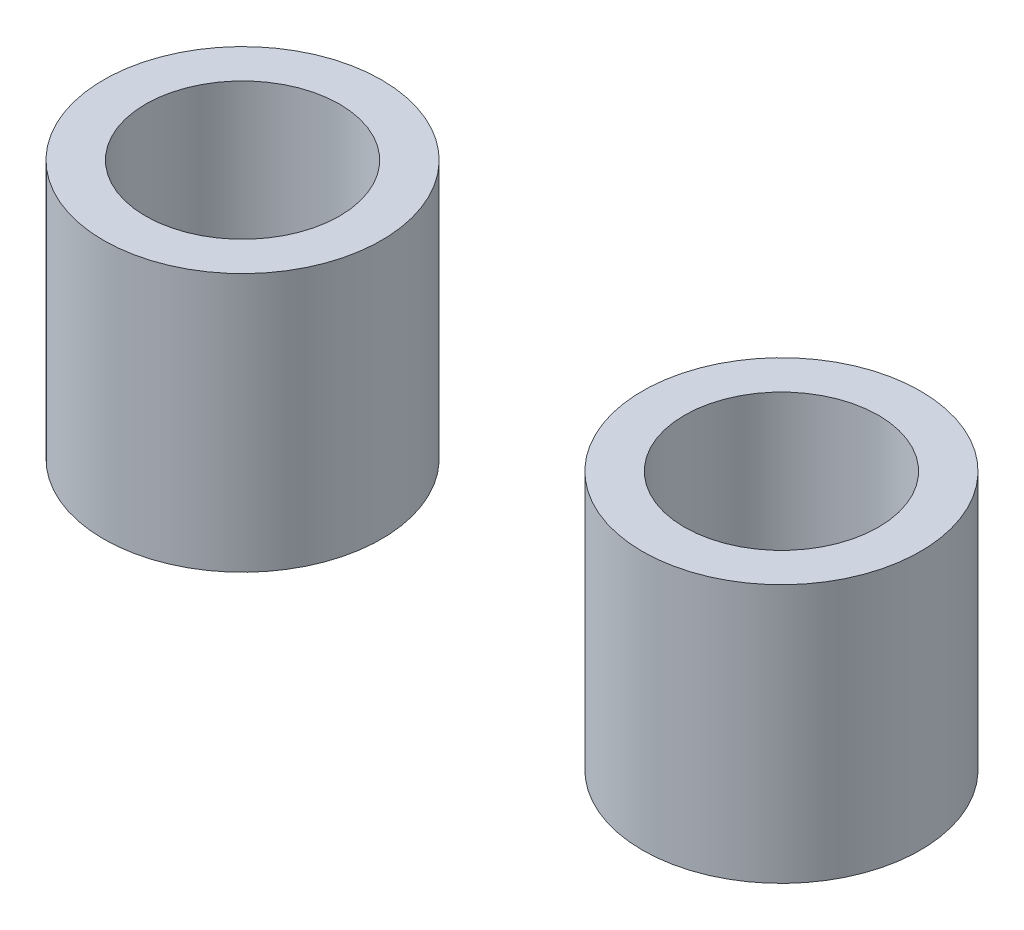
ISO-10303-21;
HEADER;
FILE_DESCRIPTION(('STEP AP214'),'2;1');
FILE_NAME('part.step','',(''),(''),'','','');
FILE_SCHEMA(('AUTOMOTIVE_DESIGN { 1 0 10303 214 1 1 1 1 }'));
ENDSEC;
DATA;
#1=APPLICATION_CONTEXT('core data for automotive mechanical design processes');
#2=APPLICATION_PROTOCOL_DEFINITION('international standard','automotive_design',2000,#1);
#3=PRODUCT_CONTEXT('',#1,'mechanical');
#4=PRODUCT('Part','Part','',(#3));
#5=PRODUCT_RELATED_PRODUCT_CATEGORY('part','',(#4));
#6=PRODUCT_DEFINITION_FORMATION('','',#4);
#7=PRODUCT_DEFINITION_CONTEXT('part definition',#1,'design');
#8=PRODUCT_DEFINITION('design','',#6,#7);
#9=PRODUCT_DEFINITION_SHAPE('','',#8);
#10=(LENGTH_UNIT() NAMED_UNIT(*) SI_UNIT(.MILLI.,.METRE.));
#11=(NAMED_UNIT(*) PLANE_ANGLE_UNIT() SI_UNIT($,.RADIAN.));
#12=(NAMED_UNIT(*) SI_UNIT($,.STERADIAN.) SOLID_ANGLE_UNIT());
#13=UNCERTAINTY_MEASURE_WITH_UNIT(LENGTH_MEASURE(1.E-05),#10,'distance_accuracy_value','');
#14=(GEOMETRIC_REPRESENTATION_CONTEXT(3) GLOBAL_UNCERTAINTY_ASSIGNED_CONTEXT((#13)) GLOBAL_UNIT_ASSIGNED_CONTEXT((#10,
#11,#12)) REPRESENTATION_CONTEXT('',''));
#15=CARTESIAN_POINT('',(0.,0.,0.));
#16=DIRECTION('',(0.,0.,1.));
#17=DIRECTION('',(1.,0.,0.));
#18=AXIS2_PLACEMENT_3D('',#15,#16,#17);
#19=CARTESIAN_POINT('',(0.,3.048,0.));
#20=DIRECTION('',(0.,1.,0.));
#21=DIRECTION('',(0.,0.,1.));
#22=AXIS2_PLACEMENT_3D('',#19,#20,#21);
#23=PLANE('',#22);
#24=CARTESIAN_POINT('',(0.,3.048,0.));
#25=DIRECTION('',(0.,1.,0.));
#26=DIRECTION('',(0.,0.,1.));
#27=AXIS2_PLACEMENT_3D('',#24,#25,#26);
#28=CIRCLE('',#27,1.6383);
#29=CARTESIAN_POINT('',(0.,3.048,-1.6383));
#30=VERTEX_POINT('',#29);
#31=EDGE_CURVE('E11',#30,#30,#28,.T.);
#32=ORIENTED_EDGE('',*,*,#31,.T.);
#33=EDGE_LOOP('',(#32));
#34=FACE_BOUND('',#33,.T.);
#35=CARTESIAN_POINT('',(0.,3.048,0.));
#36=DIRECTION('',(0.,1.,0.));
#37=DIRECTION('',(0.,0.,1.));
#38=AXIS2_PLACEMENT_3D('',#35,#36,#37);
#39=CIRCLE('',#38,1.143);
#40=CARTESIAN_POINT('',(0.,3.048,-1.143));
#41=VERTEX_POINT('',#40);
#42=EDGE_CURVE('E50',#41,#41,#39,.T.);
#43=ORIENTED_EDGE('',*,*,#42,.F.);
#44=EDGE_LOOP('',(#43));
#45=FACE_BOUND('',#44,.T.);
#46=ADVANCED_FACE('F39',(#34,#45),#23,.T.);
#47=CARTESIAN_POINT('',(0.,0.,0.));
#48=DIRECTION('',(0.,1.,0.));
#49=DIRECTION('',(0.,0.,1.));
#50=AXIS2_PLACEMENT_3D('',#47,#48,#49);
#51=PLANE('',#50);
#52=CARTESIAN_POINT('',(0.,0.,0.));
#53=DIRECTION('',(0.,1.,0.));
#54=DIRECTION('',(0.,0.,1.));
#55=AXIS2_PLACEMENT_3D('',#52,#53,#54);
#56=CIRCLE('',#55,1.6383);
#57=CARTESIAN_POINT('',(0.,0.,-1.6383));
#58=VERTEX_POINT('',#57);
#59=EDGE_CURVE('E43',#58,#58,#56,.T.);
#60=ORIENTED_EDGE('',*,*,#59,.F.);
#61=EDGE_LOOP('',(#60));
#62=FACE_BOUND('',#61,.T.);
#63=CARTESIAN_POINT('',(0.,0.,0.));
#64=DIRECTION('',(0.,1.,0.));
#65=DIRECTION('',(0.,0.,1.));
#66=AXIS2_PLACEMENT_3D('',#63,#64,#65);
#67=CIRCLE('',#66,1.143);
#68=CARTESIAN_POINT('',(0.,0.,-1.143));
#69=VERTEX_POINT('',#68);
#70=EDGE_CURVE('E52',#69,#69,#67,.T.);
#71=ORIENTED_EDGE('',*,*,#70,.T.);
#72=EDGE_LOOP('',(#71));
#73=FACE_BOUND('',#72,.T.);
#74=ADVANCED_FACE('F62',(#62,#73),#51,.F.);
#75=CARTESIAN_POINT('',(0.,3.048,0.));
#76=DIRECTION('',(0.,-1.,0.));
#77=DIRECTION('',(0.,0.,-1.));
#78=AXIS2_PLACEMENT_3D('',#75,#76,#77);
#79=CYLINDRICAL_SURFACE('',#78,1.6383);
#80=CARTESIAN_POINT('',(0.,3.048,-1.6383));
#81=CARTESIAN_POINT('',(0.,3.01625,-1.6383));
#82=CARTESIAN_POINT('',(0.,2.9845,-1.6383));
#83=CARTESIAN_POINT('',(0.,2.921,-1.6383));
#84=CARTESIAN_POINT('',(0.,2.88925,-1.6383));
#85=CARTESIAN_POINT('',(0.,2.82575,-1.6383));
#86=CARTESIAN_POINT('',(0.,2.794,-1.6383));
#87=CARTESIAN_POINT('',(0.,2.7305,-1.6383));
#88=CARTESIAN_POINT('',(0.,2.69875,-1.6383));
#89=CARTESIAN_POINT('',(0.,2.63525,-1.6383));
#90=CARTESIAN_POINT('',(0.,2.6035,-1.6383));
#91=CARTESIAN_POINT('',(0.,2.54,-1.6383));
#92=CARTESIAN_POINT('',(0.,2.50825,-1.6383));
#93=CARTESIAN_POINT('',(0.,2.44475,-1.6383));
#94=CARTESIAN_POINT('',(0.,2.413,-1.6383));
#95=CARTESIAN_POINT('',(0.,2.3495,-1.6383));
#96=CARTESIAN_POINT('',(0.,2.31775,-1.6383));
#97=CARTESIAN_POINT('',(0.,2.25425,-1.6383));
#98=CARTESIAN_POINT('',(0.,2.2225,-1.6383));
#99=CARTESIAN_POINT('',(0.,2.159,-1.6383));
#100=CARTESIAN_POINT('',(0.,2.12725,-1.6383));
#101=CARTESIAN_POINT('',(0.,2.06375,-1.6383));
#102=CARTESIAN_POINT('',(0.,2.032,-1.6383));
#103=CARTESIAN_POINT('',(0.,1.9685,-1.6383));
#104=CARTESIAN_POINT('',(0.,1.93675,-1.6383));
#105=CARTESIAN_POINT('',(0.,1.87325,-1.6383));
#106=CARTESIAN_POINT('',(0.,1.8415,-1.6383));
#107=CARTESIAN_POINT('',(0.,1.778,-1.6383));
#108=CARTESIAN_POINT('',(0.,1.74625,-1.6383));
#109=CARTESIAN_POINT('',(0.,1.68275,-1.6383));
#110=CARTESIAN_POINT('',(0.,1.651,-1.6383));
#111=CARTESIAN_POINT('',(0.,1.5875,-1.6383));
#112=CARTESIAN_POINT('',(0.,1.55575,-1.6383));
#113=CARTESIAN_POINT('',(0.,1.49225,-1.6383));
#114=CARTESIAN_POINT('',(0.,1.4605,-1.6383));
#115=CARTESIAN_POINT('',(0.,1.397,-1.6383));
#116=CARTESIAN_POINT('',(0.,1.36525,-1.6383));
#117=CARTESIAN_POINT('',(0.,1.30175,-1.6383));
#118=CARTESIAN_POINT('',(0.,1.27,-1.6383));
#119=CARTESIAN_POINT('',(0.,1.2065,-1.6383));
#120=CARTESIAN_POINT('',(0.,1.17475,-1.6383));
#121=CARTESIAN_POINT('',(0.,1.11125,-1.6383));
#122=CARTESIAN_POINT('',(0.,1.0795,-1.6383));
#123=CARTESIAN_POINT('',(0.,1.016,-1.6383));
#124=CARTESIAN_POINT('',(0.,0.98425,-1.6383));
#125=CARTESIAN_POINT('',(0.,0.92075,-1.6383));
#126=CARTESIAN_POINT('',(0.,0.889,-1.6383));
#127=CARTESIAN_POINT('',(0.,0.8255,-1.6383));
#128=CARTESIAN_POINT('',(0.,0.79375,-1.6383));
#129=CARTESIAN_POINT('',(0.,0.73025,-1.6383));
#130=CARTESIAN_POINT('',(0.,0.6985,-1.6383));
#131=CARTESIAN_POINT('',(0.,0.635,-1.6383));
#132=CARTESIAN_POINT('',(0.,0.60325,-1.6383));
#133=CARTESIAN_POINT('',(0.,0.53975,-1.6383));
#134=CARTESIAN_POINT('',(0.,0.508,-1.6383));
#135=CARTESIAN_POINT('',(0.,0.4445,-1.6383));
#136=CARTESIAN_POINT('',(0.,0.41275,-1.6383));
#137=CARTESIAN_POINT('',(0.,0.34925,-1.6383));
#138=CARTESIAN_POINT('',(0.,0.3175,-1.6383));
#139=CARTESIAN_POINT('',(0.,0.254,-1.6383));
#140=CARTESIAN_POINT('',(0.,0.22225,-1.6383));
#141=CARTESIAN_POINT('',(0.,0.15875,-1.6383));
#142=CARTESIAN_POINT('',(0.,0.127,-1.6383));
#143=CARTESIAN_POINT('',(0.,0.0634999999999999,-1.6383));
#144=CARTESIAN_POINT('',(0.,0.03175,-1.6383));
#145=CARTESIAN_POINT('',(0.,0.,-1.6383));
#146=B_SPLINE_CURVE_WITH_KNOTS('',3,(#80,#81,#82,#83,#84,#85,#86,#87,#88,#89,#90,#91,#92,#93,
#94,#95,#96,#97,#98,#99,#100,#101,#102,#103,#104,#105,#106,#107,#108,#109,#110,#111,#112,#113,
#114,#115,#116,#117,#118,#119,#120,#121,#122,#123,#124,#125,#126,#127,#128,#129,#130,#131,#132,
#133,#134,#135,#136,#137,#138,#139,#140,#141,#142,#143,#144,#145),.UNSPECIFIED.,.F.,.F.,(4,2,2,
2,2,2,2,2,2,2,2,2,2,2,2,2,2,2,2,2,2,2,2,2,2,2,2,2,2,2,2,2,4),(0.,0.0952500000000003,0.1905,
0.28575,0.381,0.47625,0.5715,0.66675,0.762,0.85725,0.9525,1.04775,1.143,1.23825,1.3335,1.42875,
1.524,1.61925,1.7145,1.80975,1.905,2.00025,2.0955,2.19075,2.286,2.38125,2.4765,2.57175,2.667,
2.76225,2.8575,2.95275,3.048),.UNSPECIFIED.);
#147=EDGE_CURVE('BSEAM41',#30,#58,#146,.T.);
#148=ORIENTED_EDGE('',*,*,#31,.F.);
#149=ORIENTED_EDGE('',*,*,#59,.T.);
#150=ORIENTED_EDGE('',*,*,#147,.T.);
#151=ORIENTED_EDGE('',*,*,#147,.F.);
#152=EDGE_LOOP('',(#148,#150,#149,#151));
#153=FACE_BOUND('',#152,.T.);
#154=ADVANCED_FACE('F41',(#153),#79,.T.);
#155=CARTESIAN_POINT('',(0.,3.048,0.));
#156=DIRECTION('',(0.,-1.,0.));
#157=DIRECTION('',(0.,0.,-1.));
#158=AXIS2_PLACEMENT_3D('',#155,#156,#157);
#159=CYLINDRICAL_SURFACE('',#158,1.143);
#160=CARTESIAN_POINT('',(0.,3.048,-1.143));
#161=CARTESIAN_POINT('',(0.,3.01625,-1.143));
#162=CARTESIAN_POINT('',(0.,2.9845,-1.143));
#163=CARTESIAN_POINT('',(0.,2.921,-1.143));
#164=CARTESIAN_POINT('',(0.,2.88925,-1.143));
#165=CARTESIAN_POINT('',(0.,2.82575,-1.143));
#166=CARTESIAN_POINT('',(0.,2.794,-1.143));
#167=CARTESIAN_POINT('',(0.,2.7305,-1.143));
#168=CARTESIAN_POINT('',(0.,2.69875,-1.143));
#169=CARTESIAN_POINT('',(0.,2.63525,-1.143));
#170=CARTESIAN_POINT('',(0.,2.6035,-1.143));
#171=CARTESIAN_POINT('',(0.,2.54,-1.143));
#172=CARTESIAN_POINT('',(0.,2.50825,-1.143));
#173=CARTESIAN_POINT('',(0.,2.44475,-1.143));
#174=CARTESIAN_POINT('',(0.,2.413,-1.143));
#175=CARTESIAN_POINT('',(0.,2.3495,-1.143));
#176=CARTESIAN_POINT('',(0.,2.31775,-1.143));
#177=CARTESIAN_POINT('',(0.,2.25425,-1.143));
#178=CARTESIAN_POINT('',(0.,2.2225,-1.143));
#179=CARTESIAN_POINT('',(0.,2.159,-1.143));
#180=CARTESIAN_POINT('',(0.,2.12725,-1.143));
#181=CARTESIAN_POINT('',(0.,2.06375,-1.143));
#182=CARTESIAN_POINT('',(0.,2.032,-1.143));
#183=CARTESIAN_POINT('',(0.,1.9685,-1.143));
#184=CARTESIAN_POINT('',(0.,1.93675,-1.143));
#185=CARTESIAN_POINT('',(0.,1.87325,-1.143));
#186=CARTESIAN_POINT('',(0.,1.8415,-1.143));
#187=CARTESIAN_POINT('',(0.,1.778,-1.143));
#188=CARTESIAN_POINT('',(0.,1.74625,-1.143));
#189=CARTESIAN_POINT('',(0.,1.68275,-1.143));
#190=CARTESIAN_POINT('',(0.,1.651,-1.143));
#191=CARTESIAN_POINT('',(0.,1.5875,-1.143));
#192=CARTESIAN_POINT('',(0.,1.55575,-1.143));
#193=CARTESIAN_POINT('',(0.,1.49225,-1.143));
#194=CARTESIAN_POINT('',(0.,1.4605,-1.143));
#195=CARTESIAN_POINT('',(0.,1.397,-1.143));
#196=CARTESIAN_POINT('',(0.,1.36525,-1.143));
#197=CARTESIAN_POINT('',(0.,1.30175,-1.143));
#198=CARTESIAN_POINT('',(0.,1.27,-1.143));
#199=CARTESIAN_POINT('',(0.,1.2065,-1.143));
#200=CARTESIAN_POINT('',(0.,1.17475,-1.143));
#201=CARTESIAN_POINT('',(0.,1.11125,-1.143));
#202=CARTESIAN_POINT('',(0.,1.0795,-1.143));
#203=CARTESIAN_POINT('',(0.,1.016,-1.143));
#204=CARTESIAN_POINT('',(0.,0.98425,-1.143));
#205=CARTESIAN_POINT('',(0.,0.92075,-1.143));
#206=CARTESIAN_POINT('',(0.,0.889,-1.143));
#207=CARTESIAN_POINT('',(0.,0.8255,-1.143));
#208=CARTESIAN_POINT('',(0.,0.79375,-1.143));
#209=CARTESIAN_POINT('',(0.,0.73025,-1.143));
#210=CARTESIAN_POINT('',(0.,0.6985,-1.143));
#211=CARTESIAN_POINT('',(0.,0.635,-1.143));
#212=CARTESIAN_POINT('',(0.,0.60325,-1.143));
#213=CARTESIAN_POINT('',(0.,0.53975,-1.143));
#214=CARTESIAN_POINT('',(0.,0.508,-1.143));
#215=CARTESIAN_POINT('',(0.,0.4445,-1.143));
#216=CARTESIAN_POINT('',(0.,0.41275,-1.143));
#217=CARTESIAN_POINT('',(0.,0.34925,-1.143));
#218=CARTESIAN_POINT('',(0.,0.3175,-1.143));
#219=CARTESIAN_POINT('',(0.,0.254,-1.143));
#220=CARTESIAN_POINT('',(0.,0.22225,-1.143));
#221=CARTESIAN_POINT('',(0.,0.15875,-1.143));
#222=CARTESIAN_POINT('',(0.,0.127,-1.143));
#223=CARTESIAN_POINT('',(0.,0.0634999999999999,-1.143));
#224=CARTESIAN_POINT('',(0.,0.03175,-1.143));
#225=CARTESIAN_POINT('',(0.,0.,-1.143));
#226=B_SPLINE_CURVE_WITH_KNOTS('',3,(#160,#161,#162,#163,#164,#165,#166,#167,#168,#169,#170,
#171,#172,#173,#174,#175,#176,#177,#178,#179,#180,#181,#182,#183,#184,#185,#186,#187,#188,#189,
#190,#191,#192,#193,#194,#195,#196,#197,#198,#199,#200,#201,#202,#203,#204,#205,#206,#207,#208,
#209,#210,#211,#212,#213,#214,#215,#216,#217,#218,#219,#220,#221,#222,#223,#224,#225),
.UNSPECIFIED.,.F.,.F.,(4,2,2,2,2,2,2,2,2,2,2,2,2,2,2,2,2,2,2,2,2,2,2,2,2,2,2,2,2,2,2,2,4),(0.,
0.0952499999999998,0.1905,0.28575,0.381,0.47625,0.5715,0.66675,0.762,0.85725,0.9525,1.04775,
1.143,1.23825,1.3335,1.42875,1.524,1.61925,1.7145,1.80975,1.905,2.00025,2.0955,2.19075,2.286,
2.38125,2.4765,2.57175,2.667,2.76225,2.8575,2.95275,3.048),.UNSPECIFIED.);
#227=EDGE_CURVE('BSEAM58',#41,#69,#226,.T.);
#228=ORIENTED_EDGE('',*,*,#42,.T.);
#229=ORIENTED_EDGE('',*,*,#70,.F.);
#230=ORIENTED_EDGE('',*,*,#227,.T.);
#231=ORIENTED_EDGE('',*,*,#227,.F.);
#232=EDGE_LOOP('',(#228,#230,#229,#231));
#233=FACE_BOUND('',#232,.T.);
#234=ADVANCED_FACE('F58',(#233),#159,.F.);
#235=CLOSED_SHELL('',(#46,#74,#154,#234));
#236=MANIFOLD_SOLID_BREP('B2',#235);
#237=CARTESIAN_POINT('',(6.35,3.048,0.));
#238=DIRECTION('',(0.,1.,0.));
#239=DIRECTION('',(0.,0.,1.));
#240=AXIS2_PLACEMENT_3D('',#237,#238,#239);
#241=PLANE('',#240);
#242=CARTESIAN_POINT('',(6.35,3.048,0.));
#243=DIRECTION('',(0.,1.,0.));
#244=DIRECTION('',(0.,0.,1.));
#245=AXIS2_PLACEMENT_3D('',#242,#243,#244);
#246=CIRCLE('',#245,1.6383);
#247=CARTESIAN_POINT('',(6.35,3.048,-1.6383));
#248=VERTEX_POINT('',#247);
#249=EDGE_CURVE('E38',#248,#248,#246,.T.);
#250=ORIENTED_EDGE('',*,*,#249,.T.);
#251=EDGE_LOOP('',(#250));
#252=FACE_BOUND('',#251,.T.);
#253=CARTESIAN_POINT('',(6.35,3.048,0.));
#254=DIRECTION('',(0.,1.,0.));
#255=DIRECTION('',(0.,0.,1.));
#256=AXIS2_PLACEMENT_3D('',#253,#254,#255);
#257=CIRCLE('',#256,1.143);
#258=CARTESIAN_POINT('',(6.35,3.048,-1.143));
#259=VERTEX_POINT('',#258);
#260=EDGE_CURVE('E112',#259,#259,#257,.T.);
#261=ORIENTED_EDGE('',*,*,#260,.F.);
#262=EDGE_LOOP('',(#261));
#263=FACE_BOUND('',#262,.T.);
#264=ADVANCED_FACE('F101',(#252,#263),#241,.T.);
#265=CARTESIAN_POINT('',(6.35,0.,0.));
#266=DIRECTION('',(0.,1.,0.));
#267=DIRECTION('',(0.,0.,1.));
#268=AXIS2_PLACEMENT_3D('',#265,#266,#267);
#269=PLANE('',#268);
#270=CARTESIAN_POINT('',(6.35,0.,0.));
#271=DIRECTION('',(0.,1.,0.));
#272=DIRECTION('',(0.,0.,1.));
#273=AXIS2_PLACEMENT_3D('',#270,#271,#272);
#274=CIRCLE('',#273,1.6383);
#275=CARTESIAN_POINT('',(6.35,0.,-1.6383));
#276=VERTEX_POINT('',#275);
#277=EDGE_CURVE('E105',#276,#276,#274,.T.);
#278=ORIENTED_EDGE('',*,*,#277,.F.);
#279=EDGE_LOOP('',(#278));
#280=FACE_BOUND('',#279,.T.);
#281=CARTESIAN_POINT('',(6.35,0.,0.));
#282=DIRECTION('',(0.,1.,0.));
#283=DIRECTION('',(0.,0.,1.));
#284=AXIS2_PLACEMENT_3D('',#281,#282,#283);
#285=CIRCLE('',#284,1.143);
#286=CARTESIAN_POINT('',(6.35,0.,-1.143));
#287=VERTEX_POINT('',#286);
#288=EDGE_CURVE('E114',#287,#287,#285,.T.);
#289=ORIENTED_EDGE('',*,*,#288,.T.);
#290=EDGE_LOOP('',(#289));
#291=FACE_BOUND('',#290,.T.);
#292=ADVANCED_FACE('F124',(#280,#291),#269,.F.);
#293=CARTESIAN_POINT('',(6.35,3.048,0.));
#294=DIRECTION('',(0.,-1.,0.));
#295=DIRECTION('',(0.,0.,-1.));
#296=AXIS2_PLACEMENT_3D('',#293,#294,#295);
#297=CYLINDRICAL_SURFACE('',#296,1.6383);
#298=CARTESIAN_POINT('',(6.35,3.048,-1.6383));
#299=CARTESIAN_POINT('',(6.35,3.01625,-1.6383));
#300=CARTESIAN_POINT('',(6.35,2.9845,-1.6383));
#301=CARTESIAN_POINT('',(6.35,2.921,-1.6383));
#302=CARTESIAN_POINT('',(6.35,2.88925,-1.6383));
#303=CARTESIAN_POINT('',(6.35,2.82575,-1.6383));
#304=CARTESIAN_POINT('',(6.35,2.794,-1.6383));
#305=CARTESIAN_POINT('',(6.35,2.7305,-1.6383));
#306=CARTESIAN_POINT('',(6.35,2.69875,-1.6383));
#307=CARTESIAN_POINT('',(6.35,2.63525,-1.6383));
#308=CARTESIAN_POINT('',(6.35,2.6035,-1.6383));
#309=CARTESIAN_POINT('',(6.35,2.54,-1.6383));
#310=CARTESIAN_POINT('',(6.35,2.50825,-1.6383));
#311=CARTESIAN_POINT('',(6.35,2.44475,-1.6383));
#312=CARTESIAN_POINT('',(6.35,2.413,-1.6383));
#313=CARTESIAN_POINT('',(6.35,2.3495,-1.6383));
#314=CARTESIAN_POINT('',(6.35,2.31775,-1.6383));
#315=CARTESIAN_POINT('',(6.35,2.25425,-1.6383));
#316=CARTESIAN_POINT('',(6.35,2.2225,-1.6383));
#317=CARTESIAN_POINT('',(6.35,2.159,-1.6383));
#318=CARTESIAN_POINT('',(6.35,2.12725,-1.6383));
#319=CARTESIAN_POINT('',(6.35,2.06375,-1.6383));
#320=CARTESIAN_POINT('',(6.35,2.032,-1.6383));
#321=CARTESIAN_POINT('',(6.35,1.9685,-1.6383));
#322=CARTESIAN_POINT('',(6.35,1.93675,-1.6383));
#323=CARTESIAN_POINT('',(6.35,1.87325,-1.6383));
#324=CARTESIAN_POINT('',(6.35,1.8415,-1.6383));
#325=CARTESIAN_POINT('',(6.35,1.778,-1.6383));
#326=CARTESIAN_POINT('',(6.35,1.74625,-1.6383));
#327=CARTESIAN_POINT('',(6.35,1.68275,-1.6383));
#328=CARTESIAN_POINT('',(6.35,1.651,-1.6383));
#329=CARTESIAN_POINT('',(6.35,1.5875,-1.6383));
#330=CARTESIAN_POINT('',(6.35,1.55575,-1.6383));
#331=CARTESIAN_POINT('',(6.35,1.49225,-1.6383));
#332=CARTESIAN_POINT('',(6.35,1.4605,-1.6383));
#333=CARTESIAN_POINT('',(6.35,1.397,-1.6383));
#334=CARTESIAN_POINT('',(6.35,1.36525,-1.6383));
#335=CARTESIAN_POINT('',(6.35,1.30175,-1.6383));
#336=CARTESIAN_POINT('',(6.35,1.27,-1.6383));
#337=CARTESIAN_POINT('',(6.35,1.2065,-1.6383));
#338=CARTESIAN_POINT('',(6.35,1.17475,-1.6383));
#339=CARTESIAN_POINT('',(6.35,1.11125,-1.6383));
#340=CARTESIAN_POINT('',(6.35,1.0795,-1.6383));
#341=CARTESIAN_POINT('',(6.35,1.016,-1.6383));
#342=CARTESIAN_POINT('',(6.35,0.98425,-1.6383));
#343=CARTESIAN_POINT('',(6.35,0.92075,-1.6383));
#344=CARTESIAN_POINT('',(6.35,0.889,-1.6383));
#345=CARTESIAN_POINT('',(6.35,0.8255,-1.6383));
#346=CARTESIAN_POINT('',(6.35,0.79375,-1.6383));
#347=CARTESIAN_POINT('',(6.35,0.73025,-1.6383));
#348=CARTESIAN_POINT('',(6.35,0.6985,-1.6383));
#349=CARTESIAN_POINT('',(6.35,0.635,-1.6383));
#350=CARTESIAN_POINT('',(6.35,0.60325,-1.6383));
#351=CARTESIAN_POINT('',(6.35,0.53975,-1.6383));
#352=CARTESIAN_POINT('',(6.35,0.508,-1.6383));
#353=CARTESIAN_POINT('',(6.35,0.4445,-1.6383));
#354=CARTESIAN_POINT('',(6.35,0.41275,-1.6383));
#355=CARTESIAN_POINT('',(6.35,0.34925,-1.6383));
#356=CARTESIAN_POINT('',(6.35,0.3175,-1.6383));
#357=CARTESIAN_POINT('',(6.35,0.254,-1.6383));
#358=CARTESIAN_POINT('',(6.35,0.22225,-1.6383));
#359=CARTESIAN_POINT('',(6.35,0.15875,-1.6383));
#360=CARTESIAN_POINT('',(6.35,0.127,-1.6383));
#361=CARTESIAN_POINT('',(6.35,0.0634999999999999,-1.6383));
#362=CARTESIAN_POINT('',(6.35,0.03175,-1.6383));
#363=CARTESIAN_POINT('',(6.35,0.,-1.6383));
#364=B_SPLINE_CURVE_WITH_KNOTS('',3,(#298,#299,#300,#301,#302,#303,#304,#305,#306,#307,#308,
#309,#310,#311,#312,#313,#314,#315,#316,#317,#318,#319,#320,#321,#322,#323,#324,#325,#326,#327,
#328,#329,#330,#331,#332,#333,#334,#335,#336,#337,#338,#339,#340,#341,#342,#343,#344,#345,#346,
#347,#348,#349,#350,#351,#352,#353,#354,#355,#356,#357,#358,#359,#360,#361,#362,#363),
.UNSPECIFIED.,.F.,.F.,(4,2,2,2,2,2,2,2,2,2,2,2,2,2,2,2,2,2,2,2,2,2,2,2,2,2,2,2,2,2,2,2,4),(0.,
0.0952500000000003,0.1905,0.28575,0.381,0.47625,0.5715,0.66675,0.762,0.85725,0.9525,1.04775,
1.143,1.23825,1.3335,1.42875,1.524,1.61925,1.7145,1.80975,1.905,2.00025,2.0955,2.19075,2.286,
2.38125,2.4765,2.57175,2.667,2.76225,2.8575,2.95275,3.048),.UNSPECIFIED.);
#365=EDGE_CURVE('BSEAM103',#248,#276,#364,.T.);
#366=ORIENTED_EDGE('',*,*,#249,.F.);
#367=ORIENTED_EDGE('',*,*,#277,.T.);
#368=ORIENTED_EDGE('',*,*,#365,.T.);
#369=ORIENTED_EDGE('',*,*,#365,.F.);
#370=EDGE_LOOP('',(#366,#368,#367,#369));
#371=FACE_BOUND('',#370,.T.);
#372=ADVANCED_FACE('F103',(#371),#297,.T.);
#373=CARTESIAN_POINT('',(6.35,3.048,0.));
#374=DIRECTION('',(0.,-1.,0.));
#375=DIRECTION('',(0.,0.,-1.));
#376=AXIS2_PLACEMENT_3D('',#373,#374,#375);
#377=CYLINDRICAL_SURFACE('',#376,1.143);
#378=CARTESIAN_POINT('',(6.35,3.048,-1.143));
#379=CARTESIAN_POINT('',(6.35,3.01625,-1.143));
#380=CARTESIAN_POINT('',(6.35,2.9845,-1.143));
#381=CARTESIAN_POINT('',(6.35,2.921,-1.143));
#382=CARTESIAN_POINT('',(6.35,2.88925,-1.143));
#383=CARTESIAN_POINT('',(6.35,2.82575,-1.143));
#384=CARTESIAN_POINT('',(6.35,2.794,-1.143));
#385=CARTESIAN_POINT('',(6.35,2.7305,-1.143));
#386=CARTESIAN_POINT('',(6.35,2.69875,-1.143));
#387=CARTESIAN_POINT('',(6.35,2.63525,-1.143));
#388=CARTESIAN_POINT('',(6.35,2.6035,-1.143));
#389=CARTESIAN_POINT('',(6.35,2.54,-1.143));
#390=CARTESIAN_POINT('',(6.35,2.50825,-1.143));
#391=CARTESIAN_POINT('',(6.35,2.44475,-1.143));
#392=CARTESIAN_POINT('',(6.35,2.413,-1.143));
#393=CARTESIAN_POINT('',(6.35,2.3495,-1.143));
#394=CARTESIAN_POINT('',(6.35,2.31775,-1.143));
#395=CARTESIAN_POINT('',(6.35,2.25425,-1.143));
#396=CARTESIAN_POINT('',(6.35,2.2225,-1.143));
#397=CARTESIAN_POINT('',(6.35,2.159,-1.143));
#398=CARTESIAN_POINT('',(6.35,2.12725,-1.143));
#399=CARTESIAN_POINT('',(6.35,2.06375,-1.143));
#400=CARTESIAN_POINT('',(6.35,2.032,-1.143));
#401=CARTESIAN_POINT('',(6.35,1.9685,-1.143));
#402=CARTESIAN_POINT('',(6.35,1.93675,-1.143));
#403=CARTESIAN_POINT('',(6.35,1.87325,-1.143));
#404=CARTESIAN_POINT('',(6.35,1.8415,-1.143));
#405=CARTESIAN_POINT('',(6.35,1.778,-1.143));
#406=CARTESIAN_POINT('',(6.35,1.74625,-1.143));
#407=CARTESIAN_POINT('',(6.35,1.68275,-1.143));
#408=CARTESIAN_POINT('',(6.35,1.651,-1.143));
#409=CARTESIAN_POINT('',(6.35,1.5875,-1.143));
#410=CARTESIAN_POINT('',(6.35,1.55575,-1.143));
#411=CARTESIAN_POINT('',(6.35,1.49225,-1.143));
#412=CARTESIAN_POINT('',(6.35,1.4605,-1.143));
#413=CARTESIAN_POINT('',(6.35,1.397,-1.143));
#414=CARTESIAN_POINT('',(6.35,1.36525,-1.143));
#415=CARTESIAN_POINT('',(6.35,1.30175,-1.143));
#416=CARTESIAN_POINT('',(6.35,1.27,-1.143));
#417=CARTESIAN_POINT('',(6.35,1.2065,-1.143));
#418=CARTESIAN_POINT('',(6.35,1.17475,-1.143));
#419=CARTESIAN_POINT('',(6.35,1.11125,-1.143));
#420=CARTESIAN_POINT('',(6.35,1.0795,-1.143));
#421=CARTESIAN_POINT('',(6.35,1.016,-1.143));
#422=CARTESIAN_POINT('',(6.35,0.98425,-1.143));
#423=CARTESIAN_POINT('',(6.35,0.92075,-1.143));
#424=CARTESIAN_POINT('',(6.35,0.889,-1.143));
#425=CARTESIAN_POINT('',(6.35,0.8255,-1.143));
#426=CARTESIAN_POINT('',(6.35,0.79375,-1.143));
#427=CARTESIAN_POINT('',(6.35,0.73025,-1.143));
#428=CARTESIAN_POINT('',(6.35,0.6985,-1.143));
#429=CARTESIAN_POINT('',(6.35,0.635,-1.143));
#430=CARTESIAN_POINT('',(6.35,0.60325,-1.143));
#431=CARTESIAN_POINT('',(6.35,0.53975,-1.143));
#432=CARTESIAN_POINT('',(6.35,0.508,-1.143));
#433=CARTESIAN_POINT('',(6.35,0.4445,-1.143));
#434=CARTESIAN_POINT('',(6.35,0.41275,-1.143));
#435=CARTESIAN_POINT('',(6.35,0.34925,-1.143));
#436=CARTESIAN_POINT('',(6.35,0.3175,-1.143));
#437=CARTESIAN_POINT('',(6.35,0.254,-1.143));
#438=CARTESIAN_POINT('',(6.35,0.22225,-1.143));
#439=CARTESIAN_POINT('',(6.35,0.15875,-1.143));
#440=CARTESIAN_POINT('',(6.35,0.127,-1.143));
#441=CARTESIAN_POINT('',(6.35,0.0634999999999999,-1.143));
#442=CARTESIAN_POINT('',(6.35,0.03175,-1.143));
#443=CARTESIAN_POINT('',(6.35,0.,-1.143));
#444=B_SPLINE_CURVE_WITH_KNOTS('',3,(#378,#379,#380,#381,#382,#383,#384,#385,#386,#387,#388,
#389,#390,#391,#392,#393,#394,#395,#396,#397,#398,#399,#400,#401,#402,#403,#404,#405,#406,#407,
#408,#409,#410,#411,#412,#413,#414,#415,#416,#417,#418,#419,#420,#421,#422,#423,#424,#425,#426,
#427,#428,#429,#430,#431,#432,#433,#434,#435,#436,#437,#438,#439,#440,#441,#442,#443),
.UNSPECIFIED.,.F.,.F.,(4,2,2,2,2,2,2,2,2,2,2,2,2,2,2,2,2,2,2,2,2,2,2,2,2,2,2,2,2,2,2,2,4),(0.,
0.0952499999999998,0.1905,0.28575,0.381,0.47625,0.5715,0.66675,0.762,0.85725,0.9525,1.04775,
1.143,1.23825,1.3335,1.42875,1.524,1.61925,1.7145,1.80975,1.905,2.00025,2.0955,2.19075,2.286,
2.38125,2.4765,2.57175,2.667,2.76225,2.8575,2.95275,3.048),.UNSPECIFIED.);
#445=EDGE_CURVE('BSEAM120',#259,#287,#444,.T.);
#446=ORIENTED_EDGE('',*,*,#260,.T.);
#447=ORIENTED_EDGE('',*,*,#288,.F.);
#448=ORIENTED_EDGE('',*,*,#445,.T.);
#449=ORIENTED_EDGE('',*,*,#445,.F.);
#450=EDGE_LOOP('',(#446,#448,#447,#449));
#451=FACE_BOUND('',#450,.T.);
#452=ADVANCED_FACE('F120',(#451),#377,.F.);
#453=CLOSED_SHELL('',(#264,#292,#372,#452));
#454=MANIFOLD_SOLID_BREP('B6',#453);
#455=ADVANCED_BREP_SHAPE_REPRESENTATION('',(#18,#236,#454),#14);
#456=SHAPE_DEFINITION_REPRESENTATION(#9,#455);
ENDSEC;
END-ISO-10303-21;
